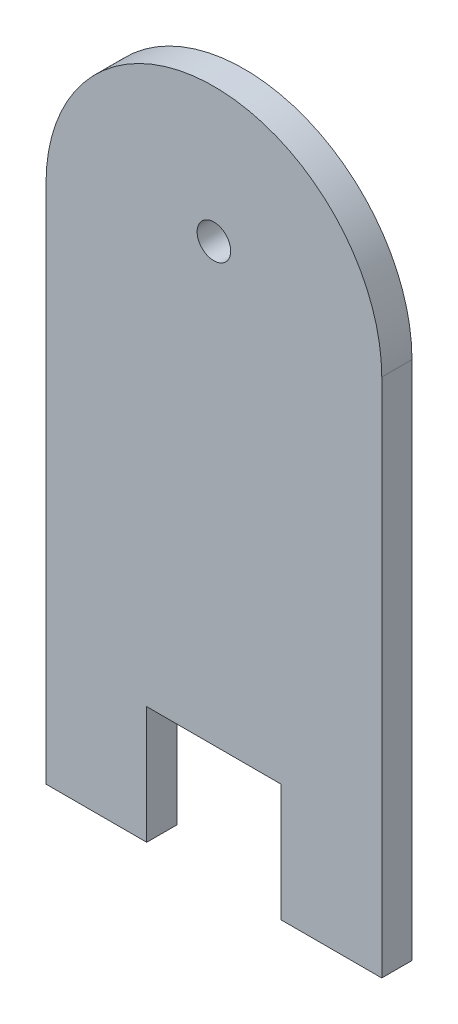
ISO-10303-21;
HEADER;
FILE_DESCRIPTION(('STEP AP214'),'2;1');
FILE_NAME('part.step','',(''),(''),'','','');
FILE_SCHEMA(('AUTOMOTIVE_DESIGN { 1 0 10303 214 1 1 1 1 }'));
ENDSEC;
DATA;
#1=APPLICATION_CONTEXT('core data for automotive mechanical design processes');
#2=APPLICATION_PROTOCOL_DEFINITION('international standard','automotive_design',2000,#1);
#3=PRODUCT_CONTEXT('',#1,'mechanical');
#4=PRODUCT('Part','Part','',(#3));
#5=PRODUCT_RELATED_PRODUCT_CATEGORY('part','',(#4));
#6=PRODUCT_DEFINITION_FORMATION('','',#4);
#7=PRODUCT_DEFINITION_CONTEXT('part definition',#1,'design');
#8=PRODUCT_DEFINITION('design','',#6,#7);
#9=PRODUCT_DEFINITION_SHAPE('','',#8);
#10=(LENGTH_UNIT() NAMED_UNIT(*) SI_UNIT(.MILLI.,.METRE.));
#11=(NAMED_UNIT(*) PLANE_ANGLE_UNIT() SI_UNIT($,.RADIAN.));
#12=(NAMED_UNIT(*) SI_UNIT($,.STERADIAN.) SOLID_ANGLE_UNIT());
#13=UNCERTAINTY_MEASURE_WITH_UNIT(LENGTH_MEASURE(1.E-05),#10,'distance_accuracy_value','');
#14=(GEOMETRIC_REPRESENTATION_CONTEXT(3) GLOBAL_UNCERTAINTY_ASSIGNED_CONTEXT((#13)) GLOBAL_UNIT_ASSIGNED_CONTEXT((#10,
#11,#12)) REPRESENTATION_CONTEXT('',''));
#15=CARTESIAN_POINT('',(0.,0.,0.));
#16=DIRECTION('',(0.,0.,1.));
#17=DIRECTION('',(1.,0.,0.));
#18=AXIS2_PLACEMENT_3D('',#15,#16,#17);
#19=CARTESIAN_POINT('',(0.,5.00000000000001,4.5));
#20=DIRECTION('',(0.,0.,-1.));
#21=DIRECTION('',(-1.,0.,0.));
#22=AXIS2_PLACEMENT_3D('',#19,#20,#21);
#23=CYLINDRICAL_SURFACE('',#22,25.);
#24=CARTESIAN_POINT('',(0.,5.00000000000001,0.));
#25=DIRECTION('',(0.,0.,1.));
#26=DIRECTION('',(1.,0.,0.));
#27=AXIS2_PLACEMENT_3D('',#24,#25,#26);
#28=CIRCLE('',#27,25.);
#29=CARTESIAN_POINT('',(25.,5.00000000000001,0.));
#30=VERTEX_POINT('',#29);
#31=CARTESIAN_POINT('',(-25.,5.,0.));
#32=VERTEX_POINT('',#31);
#33=EDGE_CURVE('E108',#30,#32,#28,.T.);
#34=ORIENTED_EDGE('',*,*,#33,.T.);
#35=DIRECTION('',(0.,0.,-1.));
#36=VECTOR('',#35,1.);
#37=CARTESIAN_POINT('',(-25.,5.,4.5));
#38=LINE('',#37,#36);
#39=CARTESIAN_POINT('',(-25.,5.,4.5));
#40=VERTEX_POINT('',#39);
#41=EDGE_CURVE('E45',#40,#32,#38,.T.);
#42=ORIENTED_EDGE('',*,*,#41,.F.);
#43=CARTESIAN_POINT('',(0.,5.00000000000001,4.5));
#44=DIRECTION('',(0.,0.,1.));
#45=DIRECTION('',(1.,0.,0.));
#46=AXIS2_PLACEMENT_3D('',#43,#44,#45);
#47=CIRCLE('',#46,25.);
#48=CARTESIAN_POINT('',(25.,5.00000000000001,4.5));
#49=VERTEX_POINT('',#48);
#50=EDGE_CURVE('E161',#49,#40,#47,.T.);
#51=ORIENTED_EDGE('',*,*,#50,.F.);
#52=DIRECTION('',(0.,0.,-1.));
#53=VECTOR('',#52,1.);
#54=CARTESIAN_POINT('',(25.,5.00000000000001,4.5));
#55=LINE('',#54,#53);
#56=EDGE_CURVE('E11',#49,#30,#55,.T.);
#57=ORIENTED_EDGE('',*,*,#56,.T.);
#58=EDGE_LOOP('',(#34,#42,#51,#57));
#59=FACE_BOUND('',#58,.T.);
#60=ADVANCED_FACE('F35',(#59),#23,.T.);
#61=CARTESIAN_POINT('',(-25.,0.,4.5));
#62=DIRECTION('',(1.,0.,0.));
#63=DIRECTION('',(0.,1.,0.));
#64=AXIS2_PLACEMENT_3D('',#61,#62,#63);
#65=PLANE('',#64);
#66=DIRECTION('',(0.,-1.,0.));
#67=VECTOR('',#66,1.);
#68=CARTESIAN_POINT('',(-25.,0.,0.));
#69=LINE('',#68,#67);
#70=CARTESIAN_POINT('',(-25.,-72.5,0.));
#71=VERTEX_POINT('',#70);
#72=EDGE_CURVE('E152',#32,#71,#69,.T.);
#73=ORIENTED_EDGE('',*,*,#72,.T.);
#74=DIRECTION('',(0.,0.,-1.));
#75=VECTOR('',#74,1.);
#76=CARTESIAN_POINT('',(-25.,-72.5,4.5));
#77=LINE('',#76,#75);
#78=CARTESIAN_POINT('',(-25.,-72.5,4.5));
#79=VERTEX_POINT('',#78);
#80=EDGE_CURVE('E130',#79,#71,#77,.T.);
#81=ORIENTED_EDGE('',*,*,#80,.F.);
#82=DIRECTION('',(0.,-1.,0.));
#83=VECTOR('',#82,1.);
#84=CARTESIAN_POINT('',(-25.,0.,4.5));
#85=LINE('',#84,#83);
#86=EDGE_CURVE('E159',#40,#79,#85,.T.);
#87=ORIENTED_EDGE('',*,*,#86,.F.);
#88=ORIENTED_EDGE('',*,*,#41,.T.);
#89=EDGE_LOOP('',(#73,#81,#87,#88));
#90=FACE_BOUND('',#89,.T.);
#91=ADVANCED_FACE('F181',(#90),#65,.F.);
#92=CARTESIAN_POINT('',(-9.99999999999998,0.,4.5));
#93=DIRECTION('',(1.,0.,0.));
#94=DIRECTION('',(0.,1.,0.));
#95=AXIS2_PLACEMENT_3D('',#92,#93,#94);
#96=PLANE('',#95);
#97=DIRECTION('',(0.,-1.,0.));
#98=VECTOR('',#97,1.);
#99=CARTESIAN_POINT('',(-9.99999999999998,0.,0.));
#100=LINE('',#99,#98);
#101=CARTESIAN_POINT('',(-9.99999999999999,-55.,0.));
#102=VERTEX_POINT('',#101);
#103=CARTESIAN_POINT('',(-9.99999999999999,-72.5,0.));
#104=VERTEX_POINT('',#103);
#105=EDGE_CURVE('E150',#102,#104,#100,.T.);
#106=ORIENTED_EDGE('',*,*,#105,.F.);
#107=DIRECTION('',(0.,0.,-1.));
#108=VECTOR('',#107,1.);
#109=CARTESIAN_POINT('',(-9.99999999999999,-55.,4.5));
#110=LINE('',#109,#108);
#111=CARTESIAN_POINT('',(-9.99999999999999,-55.,4.5));
#112=VERTEX_POINT('',#111);
#113=EDGE_CURVE('E142',#112,#102,#110,.T.);
#114=ORIENTED_EDGE('',*,*,#113,.F.);
#115=DIRECTION('',(0.,-1.,0.));
#116=VECTOR('',#115,1.);
#117=CARTESIAN_POINT('',(-9.99999999999998,0.,4.5));
#118=LINE('',#117,#116);
#119=CARTESIAN_POINT('',(-9.99999999999999,-72.5,4.5));
#120=VERTEX_POINT('',#119);
#121=EDGE_CURVE('E157',#112,#120,#118,.T.);
#122=ORIENTED_EDGE('',*,*,#121,.T.);
#123=DIRECTION('',(0.,0.,-1.));
#124=VECTOR('',#123,1.);
#125=CARTESIAN_POINT('',(-9.99999999999999,-72.5,4.5));
#126=LINE('',#125,#124);
#127=EDGE_CURVE('E111',#120,#104,#126,.T.);
#128=ORIENTED_EDGE('',*,*,#127,.T.);
#129=EDGE_LOOP('',(#106,#114,#122,#128));
#130=FACE_BOUND('',#129,.T.);
#131=ADVANCED_FACE('F189',(#130),#96,.T.);
#132=CARTESIAN_POINT('',(0.,-55.,4.5));
#133=DIRECTION('',(0.,1.,0.));
#134=DIRECTION('',(0.,0.,1.));
#135=AXIS2_PLACEMENT_3D('',#132,#133,#134);
#136=PLANE('',#135);
#137=DIRECTION('',(1.,0.,0.));
#138=VECTOR('',#137,1.);
#139=CARTESIAN_POINT('',(0.,-55.,0.));
#140=LINE('',#139,#138);
#141=CARTESIAN_POINT('',(10.,-55.,0.));
#142=VERTEX_POINT('',#141);
#143=EDGE_CURVE('E148',#102,#142,#140,.T.);
#144=ORIENTED_EDGE('',*,*,#143,.T.);
#145=DIRECTION('',(0.,0.,-1.));
#146=VECTOR('',#145,1.);
#147=CARTESIAN_POINT('',(10.,-55.,4.5));
#148=LINE('',#147,#146);
#149=CARTESIAN_POINT('',(10.,-55.,4.5));
#150=VERTEX_POINT('',#149);
#151=EDGE_CURVE('E144',#150,#142,#148,.T.);
#152=ORIENTED_EDGE('',*,*,#151,.F.);
#153=DIRECTION('',(1.,0.,0.));
#154=VECTOR('',#153,1.);
#155=CARTESIAN_POINT('',(0.,-55.,4.5));
#156=LINE('',#155,#154);
#157=EDGE_CURVE('E54',#112,#150,#156,.T.);
#158=ORIENTED_EDGE('',*,*,#157,.F.);
#159=ORIENTED_EDGE('',*,*,#113,.T.);
#160=EDGE_LOOP('',(#144,#152,#158,#159));
#161=FACE_BOUND('',#160,.T.);
#162=ADVANCED_FACE('F192',(#161),#136,.F.);
#163=CARTESIAN_POINT('',(10.0000000000001,0.,4.5));
#164=DIRECTION('',(1.,0.,0.));
#165=DIRECTION('',(0.,1.,0.));
#166=AXIS2_PLACEMENT_3D('',#163,#164,#165);
#167=PLANE('',#166);
#168=DIRECTION('',(0.,-1.,0.));
#169=VECTOR('',#168,1.);
#170=CARTESIAN_POINT('',(10.0000000000001,0.,0.));
#171=LINE('',#170,#169);
#172=CARTESIAN_POINT('',(10.,-72.5,0.));
#173=VERTEX_POINT('',#172);
#174=EDGE_CURVE('E95',#142,#173,#171,.T.);
#175=ORIENTED_EDGE('',*,*,#174,.T.);
#176=DIRECTION('',(0.,0.,-1.));
#177=VECTOR('',#176,1.);
#178=CARTESIAN_POINT('',(10.,-72.5,4.5));
#179=LINE('',#178,#177);
#180=CARTESIAN_POINT('',(10.,-72.5,4.5));
#181=VERTEX_POINT('',#180);
#182=EDGE_CURVE('E39',#181,#173,#179,.T.);
#183=ORIENTED_EDGE('',*,*,#182,.F.);
#184=DIRECTION('',(0.,-1.,0.));
#185=VECTOR('',#184,1.);
#186=CARTESIAN_POINT('',(10.0000000000001,0.,4.5));
#187=LINE('',#186,#185);
#188=EDGE_CURVE('E146',#150,#181,#187,.T.);
#189=ORIENTED_EDGE('',*,*,#188,.F.);
#190=ORIENTED_EDGE('',*,*,#151,.T.);
#191=EDGE_LOOP('',(#175,#183,#189,#190));
#192=FACE_BOUND('',#191,.T.);
#193=ADVANCED_FACE('F194',(#192),#167,.F.);
#194=CARTESIAN_POINT('',(25.,0.,4.5));
#195=DIRECTION('',(1.,0.,0.));
#196=DIRECTION('',(0.,1.,0.));
#197=AXIS2_PLACEMENT_3D('',#194,#195,#196);
#198=PLANE('',#197);
#199=DIRECTION('',(0.,-1.,0.));
#200=VECTOR('',#199,1.);
#201=CARTESIAN_POINT('',(25.,0.,0.));
#202=LINE('',#201,#200);
#203=CARTESIAN_POINT('',(25.,-72.5,0.));
#204=VERTEX_POINT('',#203);
#205=EDGE_CURVE('E102',#30,#204,#202,.T.);
#206=ORIENTED_EDGE('',*,*,#205,.F.);
#207=ORIENTED_EDGE('',*,*,#56,.F.);
#208=DIRECTION('',(0.,-1.,0.));
#209=VECTOR('',#208,1.);
#210=CARTESIAN_POINT('',(25.,0.,4.5));
#211=LINE('',#210,#209);
#212=CARTESIAN_POINT('',(25.,-72.5,4.5));
#213=VERTEX_POINT('',#212);
#214=EDGE_CURVE('E117',#49,#213,#211,.T.);
#215=ORIENTED_EDGE('',*,*,#214,.T.);
#216=DIRECTION('',(0.,0.,-1.));
#217=VECTOR('',#216,1.);
#218=CARTESIAN_POINT('',(25.,-72.5,4.5));
#219=LINE('',#218,#217);
#220=EDGE_CURVE('E114',#213,#204,#219,.T.);
#221=ORIENTED_EDGE('',*,*,#220,.T.);
#222=EDGE_LOOP('',(#206,#207,#215,#221));
#223=FACE_BOUND('',#222,.T.);
#224=ADVANCED_FACE('F115',(#223),#198,.T.);
#225=CARTESIAN_POINT('',(0.,0.,0.));
#226=DIRECTION('',(0.,0.,1.));
#227=DIRECTION('',(1.,0.,0.));
#228=AXIS2_PLACEMENT_3D('',#225,#226,#227);
#229=PLANE('',#228);
#230=CARTESIAN_POINT('',(0.,10.,0.));
#231=DIRECTION('',(0.,0.,1.));
#232=DIRECTION('',(1.,0.,0.));
#233=AXIS2_PLACEMENT_3D('',#230,#231,#232);
#234=CIRCLE('',#233,2.5);
#235=CARTESIAN_POINT('',(2.5,10.,0.));
#236=VERTEX_POINT('',#235);
#237=EDGE_CURVE('E123',#236,#236,#234,.T.);
#238=ORIENTED_EDGE('',*,*,#237,.T.);
#239=EDGE_LOOP('',(#238));
#240=FACE_BOUND('',#239,.T.);
#241=ORIENTED_EDGE('',*,*,#205,.T.);
#242=DIRECTION('',(-1.,0.,0.));
#243=VECTOR('',#242,1.);
#244=CARTESIAN_POINT('',(25.,-72.5,0.));
#245=LINE('',#244,#243);
#246=EDGE_CURVE('E106',#204,#173,#245,.T.);
#247=ORIENTED_EDGE('',*,*,#246,.T.);
#248=ORIENTED_EDGE('',*,*,#174,.F.);
#249=ORIENTED_EDGE('',*,*,#143,.F.);
#250=ORIENTED_EDGE('',*,*,#105,.T.);
#251=DIRECTION('',(-1.,0.,0.));
#252=VECTOR('',#251,1.);
#253=CARTESIAN_POINT('',(-9.99999999999999,-72.5,0.));
#254=LINE('',#253,#252);
#255=EDGE_CURVE('E121',#104,#71,#254,.T.);
#256=ORIENTED_EDGE('',*,*,#255,.T.);
#257=ORIENTED_EDGE('',*,*,#72,.F.);
#258=ORIENTED_EDGE('',*,*,#33,.F.);
#259=EDGE_LOOP('',(#241,#247,#248,#249,#250,#256,#257,#258));
#260=FACE_BOUND('',#259,.T.);
#261=ADVANCED_FACE('F104',(#240,#260),#229,.F.);
#262=CARTESIAN_POINT('',(0.,0.,4.5));
#263=DIRECTION('',(0.,0.,1.));
#264=DIRECTION('',(1.,0.,0.));
#265=AXIS2_PLACEMENT_3D('',#262,#263,#264);
#266=PLANE('',#265);
#267=CARTESIAN_POINT('',(0.,10.,4.5));
#268=DIRECTION('',(0.,0.,1.));
#269=DIRECTION('',(1.,0.,0.));
#270=AXIS2_PLACEMENT_3D('',#267,#268,#269);
#271=CIRCLE('',#270,2.5);
#272=CARTESIAN_POINT('',(2.5,10.,4.5));
#273=VERTEX_POINT('',#272);
#274=EDGE_CURVE('E127',#273,#273,#271,.T.);
#275=ORIENTED_EDGE('',*,*,#274,.F.);
#276=EDGE_LOOP('',(#275));
#277=FACE_BOUND('',#276,.T.);
#278=ORIENTED_EDGE('',*,*,#214,.F.);
#279=ORIENTED_EDGE('',*,*,#50,.T.);
#280=ORIENTED_EDGE('',*,*,#86,.T.);
#281=DIRECTION('',(-1.,0.,0.));
#282=VECTOR('',#281,1.);
#283=CARTESIAN_POINT('',(-9.99999999999999,-72.5,4.5));
#284=LINE('',#283,#282);
#285=EDGE_CURVE('E133',#120,#79,#284,.T.);
#286=ORIENTED_EDGE('',*,*,#285,.F.);
#287=ORIENTED_EDGE('',*,*,#121,.F.);
#288=ORIENTED_EDGE('',*,*,#157,.T.);
#289=ORIENTED_EDGE('',*,*,#188,.T.);
#290=DIRECTION('',(-1.,0.,0.));
#291=VECTOR('',#290,1.);
#292=CARTESIAN_POINT('',(25.,-72.5,4.5));
#293=LINE('',#292,#291);
#294=EDGE_CURVE('E122',#213,#181,#293,.T.);
#295=ORIENTED_EDGE('',*,*,#294,.F.);
#296=EDGE_LOOP('',(#278,#279,#280,#286,#287,#288,#289,#295));
#297=FACE_BOUND('',#296,.T.);
#298=ADVANCED_FACE('F171',(#277,#297),#266,.T.);
#299=CARTESIAN_POINT('',(25.,-72.5,4.5));
#300=DIRECTION('',(0.,-1.,0.));
#301=DIRECTION('',(0.,0.,-1.));
#302=AXIS2_PLACEMENT_3D('',#299,#300,#301);
#303=PLANE('',#302);
#304=ORIENTED_EDGE('',*,*,#246,.F.);
#305=ORIENTED_EDGE('',*,*,#220,.F.);
#306=ORIENTED_EDGE('',*,*,#294,.T.);
#307=ORIENTED_EDGE('',*,*,#182,.T.);
#308=EDGE_LOOP('',(#304,#305,#306,#307));
#309=FACE_BOUND('',#308,.T.);
#310=ADVANCED_FACE('F37',(#309),#303,.T.);
#311=CARTESIAN_POINT('',(-9.99999999999999,-72.5,4.5));
#312=DIRECTION('',(0.,-1.,0.));
#313=DIRECTION('',(0.,0.,-1.));
#314=AXIS2_PLACEMENT_3D('',#311,#312,#313);
#315=PLANE('',#314);
#316=ORIENTED_EDGE('',*,*,#255,.F.);
#317=ORIENTED_EDGE('',*,*,#127,.F.);
#318=ORIENTED_EDGE('',*,*,#285,.T.);
#319=ORIENTED_EDGE('',*,*,#80,.T.);
#320=EDGE_LOOP('',(#316,#317,#318,#319));
#321=FACE_BOUND('',#320,.T.);
#322=ADVANCED_FACE('F186',(#321),#315,.T.);
#323=CARTESIAN_POINT('',(0.,10.,-5.5));
#324=DIRECTION('',(0.,0.,1.));
#325=DIRECTION('',(1.,0.,0.));
#326=AXIS2_PLACEMENT_3D('',#323,#324,#325);
#327=CYLINDRICAL_SURFACE('',#326,2.5);
#328=ORIENTED_EDGE('',*,*,#274,.T.);
#329=EDGE_LOOP('',(#328));
#330=FACE_BOUND('',#329,.T.);
#331=ORIENTED_EDGE('',*,*,#237,.F.);
#332=EDGE_LOOP('',(#331));
#333=FACE_BOUND('',#332,.T.);
#334=ADVANCED_FACE('F168',(#330,#333),#327,.F.);
#335=CLOSED_SHELL('',(#60,#91,#131,#162,#193,#224,#261,#298,#310,#322,#334));
#336=MANIFOLD_SOLID_BREP('B2',#335);
#337=ADVANCED_BREP_SHAPE_REPRESENTATION('',(#18,#336),#14);
#338=SHAPE_DEFINITION_REPRESENTATION(#9,#337);
ENDSEC;
END-ISO-10303-21;
